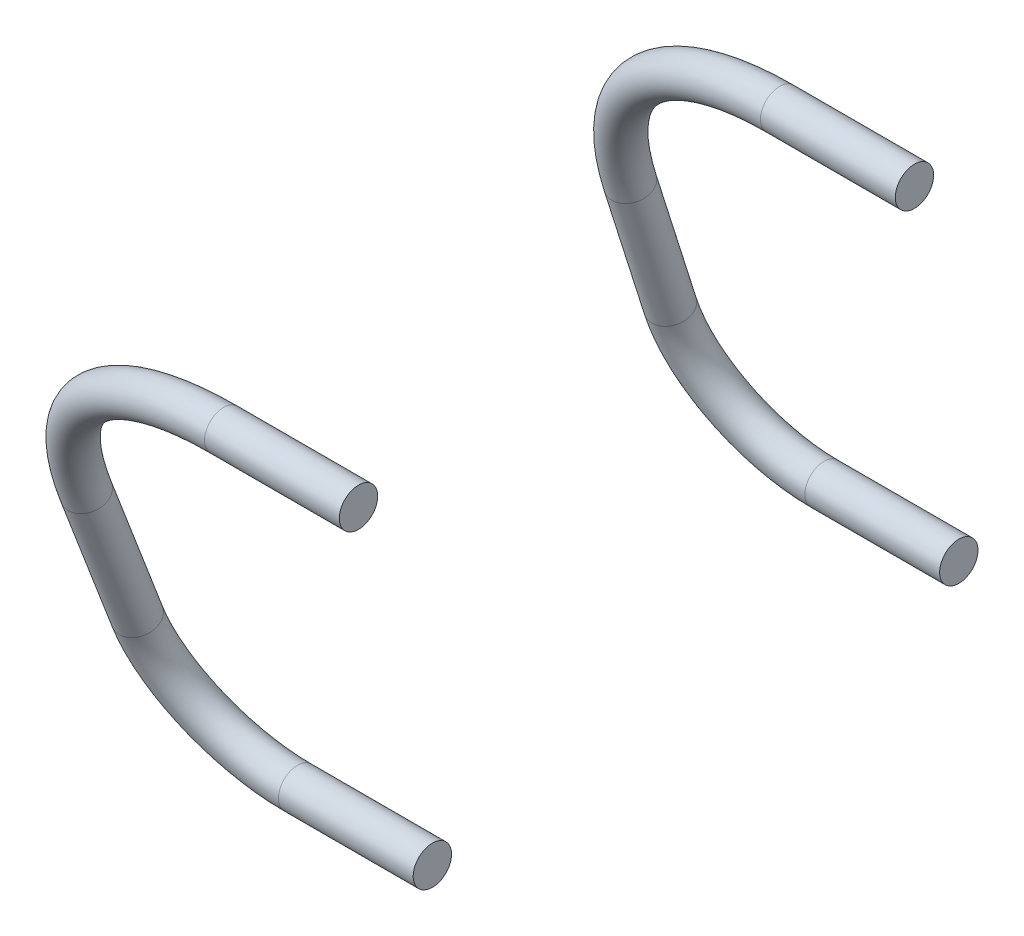
ISO-10303-21;
HEADER;
FILE_DESCRIPTION(('STEP AP214'),'2;1');
FILE_NAME('part.step','',(''),(''),'','','');
FILE_SCHEMA(('AUTOMOTIVE_DESIGN { 1 0 10303 214 1 1 1 1 }'));
ENDSEC;
DATA;
#1=APPLICATION_CONTEXT('core data for automotive mechanical design processes');
#2=APPLICATION_PROTOCOL_DEFINITION('international standard','automotive_design',2000,#1);
#3=PRODUCT_CONTEXT('',#1,'mechanical');
#4=PRODUCT('Part','Part','',(#3));
#5=PRODUCT_RELATED_PRODUCT_CATEGORY('part','',(#4));
#6=PRODUCT_DEFINITION_FORMATION('','',#4);
#7=PRODUCT_DEFINITION_CONTEXT('part definition',#1,'design');
#8=PRODUCT_DEFINITION('design','',#6,#7);
#9=PRODUCT_DEFINITION_SHAPE('','',#8);
#10=(LENGTH_UNIT() NAMED_UNIT(*) SI_UNIT(.MILLI.,.METRE.));
#11=(NAMED_UNIT(*) PLANE_ANGLE_UNIT() SI_UNIT($,.RADIAN.));
#12=(NAMED_UNIT(*) SI_UNIT($,.STERADIAN.) SOLID_ANGLE_UNIT());
#13=UNCERTAINTY_MEASURE_WITH_UNIT(LENGTH_MEASURE(1.E-05),#10,'distance_accuracy_value','');
#14=(GEOMETRIC_REPRESENTATION_CONTEXT(3) GLOBAL_UNCERTAINTY_ASSIGNED_CONTEXT((#13)) GLOBAL_UNIT_ASSIGNED_CONTEXT((#10,
#11,#12)) REPRESENTATION_CONTEXT('',''));
#15=CARTESIAN_POINT('',(0.,0.,0.));
#16=DIRECTION('',(0.,0.,1.));
#17=DIRECTION('',(1.,0.,0.));
#18=AXIS2_PLACEMENT_3D('',#15,#16,#17);
#19=CARTESIAN_POINT('',(-132.783849371952,-10.,26.75));
#20=DIRECTION('',(-1.,0.,0.));
#21=DIRECTION('',(0.,0.668442722208769,-0.743763623153304));
#22=AXIS2_PLACEMENT_3D('',#19,#20,#21);
#23=PLANE('',#22);
#24=CARTESIAN_POINT('',(-132.783849371952,-10.,26.75));
#25=DIRECTION('',(-1.,0.,0.));
#26=DIRECTION('',(0.,0.668442722208769,-0.743763623153304));
#27=AXIS2_PLACEMENT_3D('',#24,#25,#26);
#28=CIRCLE('',#27,1.95);
#29=CARTESIAN_POINT('',(-132.783849371952,-8.69653669169294,25.299660934851));
#30=VERTEX_POINT('',#29);
#31=EDGE_CURVE('E55',#30,#30,#28,.T.);
#32=ORIENTED_EDGE('',*,*,#31,.F.);
#33=EDGE_LOOP('',(#32));
#34=FACE_BOUND('',#33,.T.);
#35=ADVANCED_FACE('F43',(#34),#23,.F.);
#36=CARTESIAN_POINT('',(-123.043127582043,34.9999999999999,44.));
#37=DIRECTION('',(1.,0.,0.));
#38=DIRECTION('',(0.,0.,-1.));
#39=AXIS2_PLACEMENT_3D('',#36,#37,#38);
#40=PLANE('',#39);
#41=CARTESIAN_POINT('',(-123.043127582043,34.9999999999999,44.));
#42=DIRECTION('',(1.,0.,0.));
#43=DIRECTION('',(0.,0.,-1.));
#44=AXIS2_PLACEMENT_3D('',#41,#42,#43);
#45=CIRCLE('',#44,1.95);
#46=CARTESIAN_POINT('',(-123.043127582043,34.9999999999999,42.05));
#47=VERTEX_POINT('',#46);
#48=EDGE_CURVE('E12',#47,#47,#45,.T.);
#49=ORIENTED_EDGE('',*,*,#48,.T.);
#50=EDGE_LOOP('',(#49));
#51=FACE_BOUND('',#50,.T.);
#52=ADVANCED_FACE('F58',(#51),#40,.T.);
#53=CARTESIAN_POINT('',(-132.783849371952,-10.,26.75));
#54=DIRECTION('',(-1.,0.,0.));
#55=DIRECTION('',(0.,-1.,0.));
#56=AXIS2_PLACEMENT_3D('',#53,#54,#55);
#57=CYLINDRICAL_SURFACE('',#56,1.95);
#58=CARTESIAN_POINT('',(-146.483849371952,-10.,26.75));
#59=DIRECTION('',(-1.,0.,0.));
#60=DIRECTION('',(0.,0.668442722208769,-0.743763623153304));
#61=AXIS2_PLACEMENT_3D('',#58,#59,#60);
#62=CIRCLE('',#61,1.95);
#63=CARTESIAN_POINT('',(-146.483849371952,-11.820804928739,26.0520247773167));
#64=VERTEX_POINT('',#63);
#65=EDGE_CURVE('E75',#64,#64,#62,.T.);
#66=ORIENTED_EDGE('',*,*,#65,.F.);
#67=EDGE_LOOP('',(#66));
#68=FACE_BOUND('',#67,.T.);
#69=ORIENTED_EDGE('',*,*,#31,.T.);
#70=EDGE_LOOP('',(#69));
#71=FACE_BOUND('',#70,.T.);
#72=ADVANCED_FACE('F79',(#68,#71),#57,.T.);
#73=CARTESIAN_POINT('',(-146.483849371952,1.20495340762455,31.0452321395894));
#74=DIRECTION('',(0.,0.357936011632453,-0.933746117302049));
#75=DIRECTION('',(0.,0.933746117302049,0.357936011632453));
#76=AXIS2_PLACEMENT_3D('',#73,#74,#75);
#77=TOROIDAL_SURFACE('',#76,12.,1.95);
#78=CARTESIAN_POINT('',(-158.483849371952,1.20495340762458,31.0452321395894));
#79=DIRECTION('',(0.,0.933746117302049,0.357936011632453));
#80=DIRECTION('',(0.357936011632453,0.334221361104384,-0.871881811576652));
#81=AXIS2_PLACEMENT_3D('',#78,#79,#80);
#82=CIRCLE('',#81,1.95);
#83=CARTESIAN_POINT('',(-160.433849371952,1.20495340762459,31.0452321395894));
#84=VERTEX_POINT('',#83);
#85=EDGE_CURVE('E70',#84,#84,#82,.T.);
#86=CARTESIAN_POINT('',(-146.483849371952,1.20495340762455,31.0452321395894));
#87=DIRECTION('',(0.,0.357936011632453,-0.933746117302049));
#88=DIRECTION('',(0.,0.933746117302049,0.357936011632453));
#89=AXIS2_PLACEMENT_3D('',#86,#87,#88);
#90=CIRCLE('',#89,13.95);
#91=EDGE_CURVE('',#64,#84,#90,.T.);
#92=ORIENTED_EDGE('',*,*,#65,.T.);
#93=ORIENTED_EDGE('',*,*,#85,.F.);
#94=ORIENTED_EDGE('',*,*,#91,.T.);
#95=ORIENTED_EDGE('',*,*,#91,.F.);
#96=EDGE_LOOP('',(#92,#94,#93,#95));
#97=FACE_BOUND('',#96,.T.);
#98=ADVANCED_FACE('F81',(#97),#77,.T.);
#99=CARTESIAN_POINT('',(-158.483849371952,1.20495340762461,31.0452321395894));
#100=DIRECTION('',(0.,0.933746117302049,0.357936011632453));
#101=DIRECTION('',(0.,-0.357936011632453,0.933746117302049));
#102=AXIS2_PLACEMENT_3D('',#99,#100,#101);
#103=CYLINDRICAL_SURFACE('',#102,1.95);
#104=CARTESIAN_POINT('',(-158.483849371952,14.6996854413289,36.2182127525094));
#105=DIRECTION('',(0.,0.933746117302049,0.357936011632453));
#106=DIRECTION('',(0.357936011632453,0.334221361104384,-0.871881811576652));
#107=AXIS2_PLACEMENT_3D('',#104,#105,#106);
#108=CIRCLE('',#107,1.95);
#109=CARTESIAN_POINT('',(-160.433849371952,14.6996854413289,36.2182127525094));
#110=VERTEX_POINT('',#109);
#111=EDGE_CURVE('E68',#110,#110,#108,.T.);
#112=ORIENTED_EDGE('',*,*,#111,.F.);
#113=EDGE_LOOP('',(#112));
#114=FACE_BOUND('',#113,.T.);
#115=ORIENTED_EDGE('',*,*,#85,.T.);
#116=EDGE_LOOP('',(#115));
#117=FACE_BOUND('',#116,.T.);
#118=ADVANCED_FACE('F88',(#114,#117),#103,.T.);
#119=CARTESIAN_POINT('',(-136.743127582044,14.6996854413288,36.2182127525094));
#120=DIRECTION('',(0.,0.357936011632453,-0.933746117302049));
#121=DIRECTION('',(0.,0.933746117302049,0.357936011632453));
#122=AXIS2_PLACEMENT_3D('',#119,#120,#121);
#123=TOROIDAL_SURFACE('',#122,21.7407217899084,1.95);
#124=CARTESIAN_POINT('',(-136.743127582043,34.9999999999999,44.));
#125=DIRECTION('',(1.,0.,0.));
#126=DIRECTION('',(0.,0.,-1.));
#127=AXIS2_PLACEMENT_3D('',#124,#125,#126);
#128=CIRCLE('',#127,1.95);
#129=CARTESIAN_POINT('',(-136.743127582043,36.8208049287389,44.6979752226833));
#130=VERTEX_POINT('',#129);
#131=EDGE_CURVE('E50',#130,#130,#128,.T.);
#132=CARTESIAN_POINT('',(-136.743127582044,14.6996854413288,36.2182127525094));
#133=DIRECTION('',(0.,0.357936011632453,-0.933746117302049));
#134=DIRECTION('',(0.,0.933746117302049,0.357936011632453));
#135=AXIS2_PLACEMENT_3D('',#132,#133,#134);
#136=CIRCLE('',#135,23.6907217899084);
#137=EDGE_CURVE('',#110,#130,#136,.T.);
#138=ORIENTED_EDGE('',*,*,#111,.T.);
#139=ORIENTED_EDGE('',*,*,#131,.F.);
#140=ORIENTED_EDGE('',*,*,#137,.T.);
#141=ORIENTED_EDGE('',*,*,#137,.F.);
#142=EDGE_LOOP('',(#138,#140,#139,#141));
#143=FACE_BOUND('',#142,.T.);
#144=ADVANCED_FACE('F63',(#143),#123,.T.);
#145=CARTESIAN_POINT('',(-136.743127582043,34.9999999999999,44.));
#146=DIRECTION('',(1.,0.,0.));
#147=DIRECTION('',(0.,0.,-1.));
#148=AXIS2_PLACEMENT_3D('',#145,#146,#147);
#149=CYLINDRICAL_SURFACE('',#148,1.95);
#150=ORIENTED_EDGE('',*,*,#48,.F.);
#151=EDGE_LOOP('',(#150));
#152=FACE_BOUND('',#151,.T.);
#153=ORIENTED_EDGE('',*,*,#131,.T.);
#154=EDGE_LOOP('',(#153));
#155=FACE_BOUND('',#154,.T.);
#156=ADVANCED_FACE('F60',(#152,#155),#149,.T.);
#157=CLOSED_SHELL('',(#35,#52,#72,#98,#118,#144,#156));
#158=MANIFOLD_SOLID_BREP('B2',#157);
#159=CARTESIAN_POINT('',(-132.783849371952,-9.99999999999995,-26.75));
#160=DIRECTION('',(-1.,0.,0.));
#161=DIRECTION('',(0.,0.575612219136581,-0.817722797273416));
#162=AXIS2_PLACEMENT_3D('',#159,#160,#161);
#163=PLANE('',#162);
#164=CARTESIAN_POINT('',(-132.783849371952,-9.99999999999995,-26.75));
#165=DIRECTION('',(-1.,0.,0.));
#166=DIRECTION('',(0.,0.575612219136581,-0.817722797273416));
#167=AXIS2_PLACEMENT_3D('',#164,#165,#166);
#168=CIRCLE('',#167,1.95);
#169=CARTESIAN_POINT('',(-132.783849371952,-8.87755617268361,-28.3445594546831));
#170=VERTEX_POINT('',#169);
#171=EDGE_CURVE('E158',#170,#170,#168,.T.);
#172=ORIENTED_EDGE('',*,*,#171,.F.);
#173=EDGE_LOOP('',(#172));
#174=FACE_BOUND('',#173,.T.);
#175=ADVANCED_FACE('F146',(#174),#163,.F.);
#176=CARTESIAN_POINT('',(-123.043127582043,34.9999999999999,-12.5));
#177=DIRECTION('',(1.,0.,0.));
#178=DIRECTION('',(0.,0.,-1.));
#179=AXIS2_PLACEMENT_3D('',#176,#177,#178);
#180=PLANE('',#179);
#181=CARTESIAN_POINT('',(-123.043127582043,34.9999999999999,-12.5));
#182=DIRECTION('',(1.,0.,0.));
#183=DIRECTION('',(0.,0.,-1.));
#184=AXIS2_PLACEMENT_3D('',#181,#182,#183);
#185=CIRCLE('',#184,1.95);
#186=CARTESIAN_POINT('',(-123.043127582043,34.9999999999999,-14.45));
#187=VERTEX_POINT('',#186);
#188=EDGE_CURVE('E41',#187,#187,#185,.T.);
#189=ORIENTED_EDGE('',*,*,#188,.T.);
#190=EDGE_LOOP('',(#189));
#191=FACE_BOUND('',#190,.T.);
#192=ADVANCED_FACE('F161',(#191),#180,.T.);
#193=CARTESIAN_POINT('',(-132.783849371952,-9.99999999999995,-26.75));
#194=DIRECTION('',(-1.,0.,0.));
#195=DIRECTION('',(0.,0.,1.));
#196=AXIS2_PLACEMENT_3D('',#193,#194,#195);
#197=CYLINDRICAL_SURFACE('',#196,1.95);
#198=CARTESIAN_POINT('',(-146.483849371952,-9.99999999999995,-26.75));
#199=DIRECTION('',(-1.,0.,0.));
#200=DIRECTION('',(0.,0.575612219136581,-0.817722797273416));
#201=AXIS2_PLACEMENT_3D('',#198,#199,#200);
#202=CIRCLE('',#201,1.95);
#203=CARTESIAN_POINT('',(-146.483849371952,-11.8590173394339,-27.338688824154));
#204=VERTEX_POINT('',#203);
#205=EDGE_CURVE('E178',#204,#204,#202,.T.);
#206=ORIENTED_EDGE('',*,*,#205,.F.);
#207=EDGE_LOOP('',(#206));
#208=FACE_BOUND('',#207,.T.);
#209=ORIENTED_EDGE('',*,*,#171,.T.);
#210=EDGE_LOOP('',(#209));
#211=FACE_BOUND('',#210,.T.);
#212=ADVANCED_FACE('F182',(#208,#211),#197,.T.);
#213=CARTESIAN_POINT('',(-146.483849371952,1.44010670420898,-23.1272995436671));
#214=DIRECTION('',(0.,0.301891704694402,-0.953342225350744));
#215=DIRECTION('',(0.,0.953342225350744,0.301891704694402));
#216=AXIS2_PLACEMENT_3D('',#213,#214,#215);
#217=TOROIDAL_SURFACE('',#216,12.,1.95);
#218=CARTESIAN_POINT('',(-158.483849371952,1.44010670420898,-23.1272995436671));
#219=DIRECTION('',(0.,0.953342225350743,0.301891704694402));
#220=DIRECTION('',(0.301891704694401,0.287806109568291,-0.908861398636708));
#221=AXIS2_PLACEMENT_3D('',#218,#219,#220);
#222=CIRCLE('',#221,1.95);
#223=CARTESIAN_POINT('',(-160.433849371952,1.44010670420898,-23.1272995436671));
#224=VERTEX_POINT('',#223);
#225=EDGE_CURVE('E173',#224,#224,#222,.T.);
#226=CARTESIAN_POINT('',(-146.483849371952,1.44010670420898,-23.1272995436671));
#227=DIRECTION('',(0.,0.301891704694402,-0.953342225350744));
#228=DIRECTION('',(0.,0.953342225350744,0.301891704694402));
#229=AXIS2_PLACEMENT_3D('',#226,#227,#228);
#230=CIRCLE('',#229,13.95);
#231=EDGE_CURVE('',#204,#224,#230,.T.);
#232=ORIENTED_EDGE('',*,*,#205,.T.);
#233=ORIENTED_EDGE('',*,*,#225,.F.);
#234=ORIENTED_EDGE('',*,*,#231,.T.);
#235=ORIENTED_EDGE('',*,*,#231,.F.);
#236=EDGE_LOOP('',(#232,#234,#233,#235));
#237=FACE_BOUND('',#236,.T.);
#238=ADVANCED_FACE('F184',(#237),#217,.T.);
#239=CARTESIAN_POINT('',(-158.483849371952,1.44010670420898,-23.1272995436671));
#240=DIRECTION('',(0.,0.953342225350744,0.301891704694402));
#241=DIRECTION('',(0.,-0.301891704694402,0.953342225350744));
#242=AXIS2_PLACEMENT_3D('',#239,#240,#241);
#243=CYLINDRICAL_SURFACE('',#242,1.95);
#244=CARTESIAN_POINT('',(-158.483849371952,14.2736519080773,-19.0633435624422));
#245=DIRECTION('',(0.,0.953342225350744,0.301891704694402));
#246=DIRECTION('',(0.301891704694401,0.287806109568292,-0.908861398636708));
#247=AXIS2_PLACEMENT_3D('',#244,#245,#246);
#248=CIRCLE('',#247,1.95);
#249=CARTESIAN_POINT('',(-160.433849371952,14.2736519080773,-19.0633435624422));
#250=VERTEX_POINT('',#249);
#251=EDGE_CURVE('E171',#250,#250,#248,.T.);
#252=ORIENTED_EDGE('',*,*,#251,.F.);
#253=EDGE_LOOP('',(#252));
#254=FACE_BOUND('',#253,.T.);
#255=ORIENTED_EDGE('',*,*,#225,.T.);
#256=EDGE_LOOP('',(#255));
#257=FACE_BOUND('',#256,.T.);
#258=ADVANCED_FACE('F191',(#254,#257),#243,.T.);
#259=CARTESIAN_POINT('',(-136.743127582043,14.2736519080773,-19.0633435624422));
#260=DIRECTION('',(0.,0.301891704694402,-0.953342225350744));
#261=DIRECTION('',(0.,0.953342225350744,0.301891704694402));
#262=AXIS2_PLACEMENT_3D('',#259,#260,#261);
#263=TOROIDAL_SURFACE('',#262,21.7407217899084,1.95);
#264=CARTESIAN_POINT('',(-136.743127582043,35.,-12.5));
#265=DIRECTION('',(1.,0.,0.));
#266=DIRECTION('',(0.,0.,-1.));
#267=AXIS2_PLACEMENT_3D('',#264,#265,#266);
#268=CIRCLE('',#267,1.95);
#269=CARTESIAN_POINT('',(-136.743127582043,36.8590173394339,-11.9113111758459));
#270=VERTEX_POINT('',#269);
#271=EDGE_CURVE('E153',#270,#270,#268,.T.);
#272=CARTESIAN_POINT('',(-136.743127582043,14.2736519080773,-19.0633435624422));
#273=DIRECTION('',(0.,0.301891704694402,-0.953342225350744));
#274=DIRECTION('',(0.,0.953342225350744,0.301891704694402));
#275=AXIS2_PLACEMENT_3D('',#272,#273,#274);
#276=CIRCLE('',#275,23.6907217899084);
#277=EDGE_CURVE('',#250,#270,#276,.T.);
#278=ORIENTED_EDGE('',*,*,#251,.T.);
#279=ORIENTED_EDGE('',*,*,#271,.F.);
#280=ORIENTED_EDGE('',*,*,#277,.T.);
#281=ORIENTED_EDGE('',*,*,#277,.F.);
#282=EDGE_LOOP('',(#278,#280,#279,#281));
#283=FACE_BOUND('',#282,.T.);
#284=ADVANCED_FACE('F166',(#283),#263,.T.);
#285=CARTESIAN_POINT('',(-136.743127582043,34.9999999999999,-12.5));
#286=DIRECTION('',(1.,0.,0.));
#287=DIRECTION('',(0.,0.,-1.));
#288=AXIS2_PLACEMENT_3D('',#285,#286,#287);
#289=CYLINDRICAL_SURFACE('',#288,1.95);
#290=ORIENTED_EDGE('',*,*,#188,.F.);
#291=EDGE_LOOP('',(#290));
#292=FACE_BOUND('',#291,.T.);
#293=ORIENTED_EDGE('',*,*,#271,.T.);
#294=EDGE_LOOP('',(#293));
#295=FACE_BOUND('',#294,.T.);
#296=ADVANCED_FACE('F163',(#292,#295),#289,.T.);
#297=CLOSED_SHELL('',(#175,#192,#212,#238,#258,#284,#296));
#298=MANIFOLD_SOLID_BREP('B6',#297);
#299=ADVANCED_BREP_SHAPE_REPRESENTATION('',(#18,#158,#298),#14);
#300=SHAPE_DEFINITION_REPRESENTATION(#9,#299);
ENDSEC;
END-ISO-10303-21;
